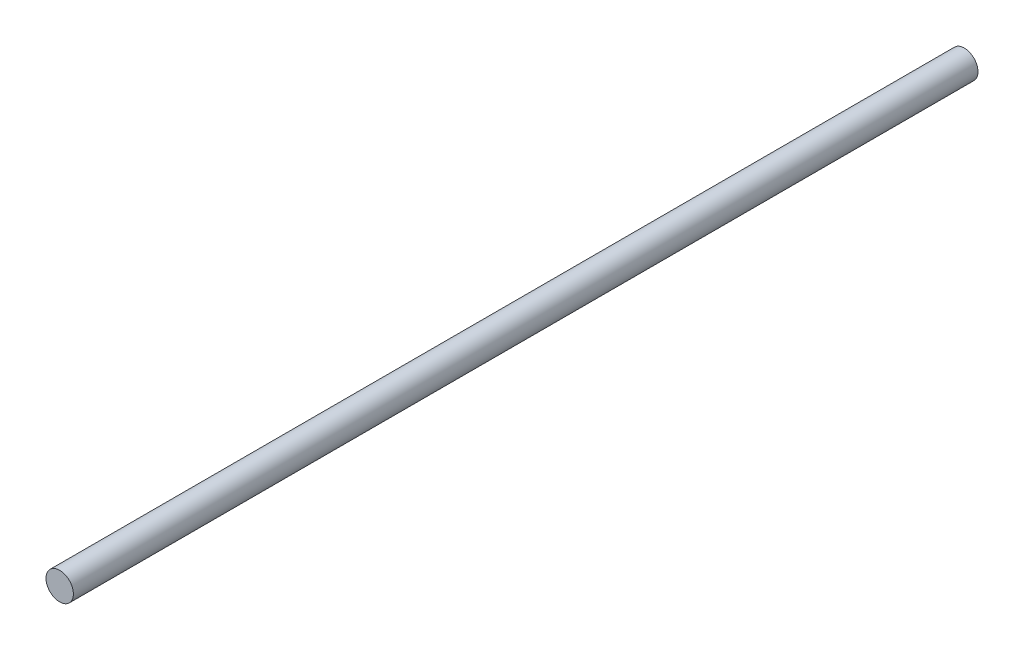
ISO-10303-21;
HEADER;
FILE_DESCRIPTION(('STEP AP214'),'2;1');
FILE_NAME('part.step','',(''),(''),'','','');
FILE_SCHEMA(('AUTOMOTIVE_DESIGN { 1 0 10303 214 1 1 1 1 }'));
ENDSEC;
DATA;
#1=APPLICATION_CONTEXT('core data for automotive mechanical design processes');
#2=APPLICATION_PROTOCOL_DEFINITION('international standard','automotive_design',2000,#1);
#3=PRODUCT_CONTEXT('',#1,'mechanical');
#4=PRODUCT('Part','Part','',(#3));
#5=PRODUCT_RELATED_PRODUCT_CATEGORY('part','',(#4));
#6=PRODUCT_DEFINITION_FORMATION('','',#4);
#7=PRODUCT_DEFINITION_CONTEXT('part definition',#1,'design');
#8=PRODUCT_DEFINITION('design','',#6,#7);
#9=PRODUCT_DEFINITION_SHAPE('','',#8);
#10=(LENGTH_UNIT() NAMED_UNIT(*) SI_UNIT(.MILLI.,.METRE.));
#11=(NAMED_UNIT(*) PLANE_ANGLE_UNIT() SI_UNIT($,.RADIAN.));
#12=(NAMED_UNIT(*) SI_UNIT($,.STERADIAN.) SOLID_ANGLE_UNIT());
#13=UNCERTAINTY_MEASURE_WITH_UNIT(LENGTH_MEASURE(1.E-05),#10,'distance_accuracy_value','');
#14=(GEOMETRIC_REPRESENTATION_CONTEXT(3) GLOBAL_UNCERTAINTY_ASSIGNED_CONTEXT((#13)) GLOBAL_UNIT_ASSIGNED_CONTEXT((#10,
#11,#12)) REPRESENTATION_CONTEXT('',''));
#15=CARTESIAN_POINT('',(0.,0.,0.));
#16=DIRECTION('',(0.,0.,1.));
#17=DIRECTION('',(1.,0.,0.));
#18=AXIS2_PLACEMENT_3D('',#15,#16,#17);
#19=CARTESIAN_POINT('',(0.,0.,264.));
#20=DIRECTION('',(0.,0.,-1.));
#21=DIRECTION('',(-1.,0.,0.));
#22=AXIS2_PLACEMENT_3D('',#19,#20,#21);
#23=CYLINDRICAL_SURFACE('',#22,4.);
#24=CARTESIAN_POINT('',(0.,0.,264.));
#25=DIRECTION('',(0.,0.,1.));
#26=DIRECTION('',(1.,0.,0.));
#27=AXIS2_PLACEMENT_3D('',#24,#25,#26);
#28=CIRCLE('',#27,4.);
#29=CARTESIAN_POINT('',(4.,0.,264.));
#30=VERTEX_POINT('',#29);
#31=EDGE_CURVE('E10',#30,#30,#28,.T.);
#32=ORIENTED_EDGE('',*,*,#31,.F.);
#33=EDGE_LOOP('',(#32));
#34=FACE_BOUND('',#33,.T.);
#35=CARTESIAN_POINT('',(0.,0.,0.));
#36=DIRECTION('',(0.,0.,1.));
#37=DIRECTION('',(1.,0.,0.));
#38=AXIS2_PLACEMENT_3D('',#35,#36,#37);
#39=CIRCLE('',#38,4.);
#40=CARTESIAN_POINT('',(4.,0.,0.));
#41=VERTEX_POINT('',#40);
#42=EDGE_CURVE('E37',#41,#41,#39,.T.);
#43=ORIENTED_EDGE('',*,*,#42,.T.);
#44=EDGE_LOOP('',(#43));
#45=FACE_BOUND('',#44,.T.);
#46=ADVANCED_FACE('F34',(#34,#45),#23,.T.);
#47=CARTESIAN_POINT('',(0.,0.,264.));
#48=DIRECTION('',(0.,0.,1.));
#49=DIRECTION('',(1.,0.,0.));
#50=AXIS2_PLACEMENT_3D('',#47,#48,#49);
#51=PLANE('',#50);
#52=ORIENTED_EDGE('',*,*,#31,.T.);
#53=EDGE_LOOP('',(#52));
#54=FACE_BOUND('',#53,.T.);
#55=ADVANCED_FACE('F49',(#54),#51,.T.);
#56=CARTESIAN_POINT('',(0.,0.,0.));
#57=DIRECTION('',(0.,0.,1.));
#58=DIRECTION('',(1.,0.,0.));
#59=AXIS2_PLACEMENT_3D('',#56,#57,#58);
#60=PLANE('',#59);
#61=ORIENTED_EDGE('',*,*,#42,.F.);
#62=EDGE_LOOP('',(#61));
#63=FACE_BOUND('',#62,.T.);
#64=ADVANCED_FACE('F47',(#63),#60,.F.);
#65=CLOSED_SHELL('',(#46,#55,#64));
#66=MANIFOLD_SOLID_BREP('B2',#65);
#67=ADVANCED_BREP_SHAPE_REPRESENTATION('',(#18,#66),#14);
#68=SHAPE_DEFINITION_REPRESENTATION(#9,#67);
ENDSEC;
END-ISO-10303-21;
